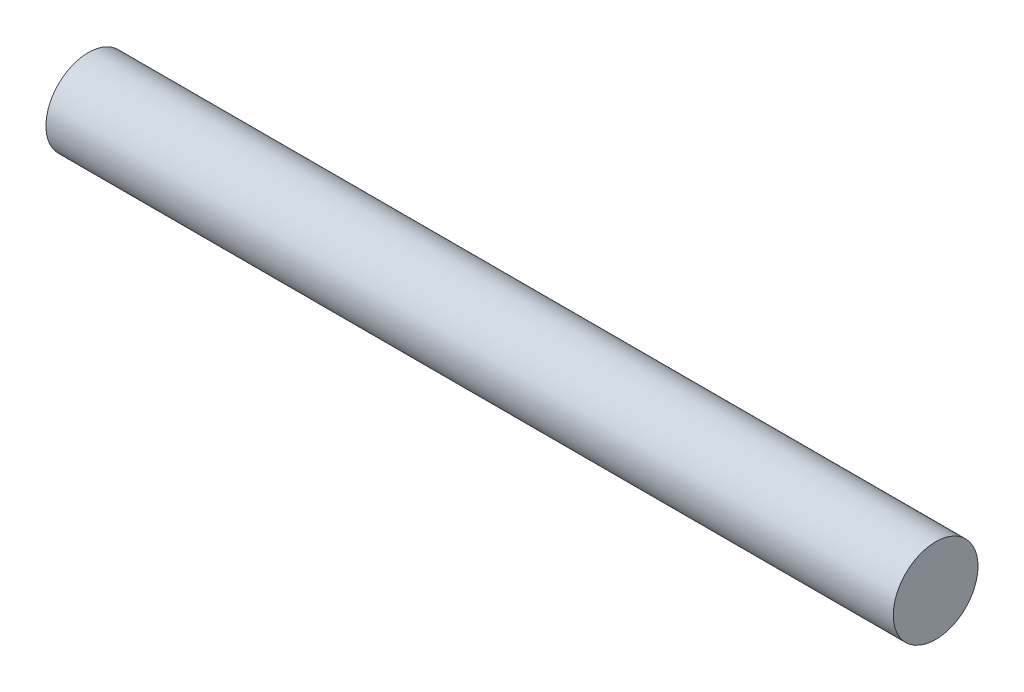
ISO-10303-21;
HEADER;
FILE_DESCRIPTION(('STEP AP214'),'2;1');
FILE_NAME('part.step','',(''),(''),'','','');
FILE_SCHEMA(('AUTOMOTIVE_DESIGN { 1 0 10303 214 1 1 1 1 }'));
ENDSEC;
DATA;
#1=APPLICATION_CONTEXT('core data for automotive mechanical design processes');
#2=APPLICATION_PROTOCOL_DEFINITION('international standard','automotive_design',2000,#1);
#3=PRODUCT_CONTEXT('',#1,'mechanical');
#4=PRODUCT('Part','Part','',(#3));
#5=PRODUCT_RELATED_PRODUCT_CATEGORY('part','',(#4));
#6=PRODUCT_DEFINITION_FORMATION('','',#4);
#7=PRODUCT_DEFINITION_CONTEXT('part definition',#1,'design');
#8=PRODUCT_DEFINITION('design','',#6,#7);
#9=PRODUCT_DEFINITION_SHAPE('','',#8);
#10=(LENGTH_UNIT() NAMED_UNIT(*) SI_UNIT(.MILLI.,.METRE.));
#11=(NAMED_UNIT(*) PLANE_ANGLE_UNIT() SI_UNIT($,.RADIAN.));
#12=(NAMED_UNIT(*) SI_UNIT($,.STERADIAN.) SOLID_ANGLE_UNIT());
#13=UNCERTAINTY_MEASURE_WITH_UNIT(LENGTH_MEASURE(1.E-05),#10,'distance_accuracy_value','');
#14=(GEOMETRIC_REPRESENTATION_CONTEXT(3) GLOBAL_UNCERTAINTY_ASSIGNED_CONTEXT((#13)) GLOBAL_UNIT_ASSIGNED_CONTEXT((#10,
#11,#12)) REPRESENTATION_CONTEXT('',''));
#15=CARTESIAN_POINT('',(0.,0.,0.));
#16=DIRECTION('',(0.,0.,1.));
#17=DIRECTION('',(1.,0.,0.));
#18=AXIS2_PLACEMENT_3D('',#15,#16,#17);
#19=CARTESIAN_POINT('',(12.7,0.,0.));
#20=DIRECTION('',(-1.,0.,0.));
#21=DIRECTION('',(0.,0.,1.));
#22=AXIS2_PLACEMENT_3D('',#19,#20,#21);
#23=CYLINDRICAL_SURFACE('',#22,0.635);
#24=CARTESIAN_POINT('',(12.7,0.,0.));
#25=DIRECTION('',(1.,0.,0.));
#26=DIRECTION('',(0.,0.,-1.));
#27=AXIS2_PLACEMENT_3D('',#24,#25,#26);
#28=CIRCLE('',#27,0.635);
#29=CARTESIAN_POINT('',(12.7,0.,-0.635));
#30=VERTEX_POINT('',#29);
#31=EDGE_CURVE('E10',#30,#30,#28,.T.);
#32=ORIENTED_EDGE('',*,*,#31,.F.);
#33=EDGE_LOOP('',(#32));
#34=FACE_BOUND('',#33,.T.);
#35=CARTESIAN_POINT('',(0.,0.,0.));
#36=DIRECTION('',(1.,0.,0.));
#37=DIRECTION('',(0.,0.,-1.));
#38=AXIS2_PLACEMENT_3D('',#35,#36,#37);
#39=CIRCLE('',#38,0.635);
#40=CARTESIAN_POINT('',(0.,0.,-0.635));
#41=VERTEX_POINT('',#40);
#42=EDGE_CURVE('E34',#41,#41,#39,.T.);
#43=ORIENTED_EDGE('',*,*,#42,.T.);
#44=EDGE_LOOP('',(#43));
#45=FACE_BOUND('',#44,.T.);
#46=ADVANCED_FACE('F31',(#34,#45),#23,.T.);
#47=CARTESIAN_POINT('',(12.7,0.,0.));
#48=DIRECTION('',(1.,0.,0.));
#49=DIRECTION('',(0.,0.,-1.));
#50=AXIS2_PLACEMENT_3D('',#47,#48,#49);
#51=PLANE('',#50);
#52=ORIENTED_EDGE('',*,*,#31,.T.);
#53=EDGE_LOOP('',(#52));
#54=FACE_BOUND('',#53,.T.);
#55=ADVANCED_FACE('F46',(#54),#51,.T.);
#56=CARTESIAN_POINT('',(0.,0.,0.));
#57=DIRECTION('',(1.,0.,0.));
#58=DIRECTION('',(0.,0.,-1.));
#59=AXIS2_PLACEMENT_3D('',#56,#57,#58);
#60=PLANE('',#59);
#61=ORIENTED_EDGE('',*,*,#42,.F.);
#62=EDGE_LOOP('',(#61));
#63=FACE_BOUND('',#62,.T.);
#64=ADVANCED_FACE('F44',(#63),#60,.F.);
#65=CLOSED_SHELL('',(#46,#55,#64));
#66=MANIFOLD_SOLID_BREP('B2',#65);
#67=ADVANCED_BREP_SHAPE_REPRESENTATION('',(#18,#66),#14);
#68=SHAPE_DEFINITION_REPRESENTATION(#9,#67);
ENDSEC;
END-ISO-10303-21;
